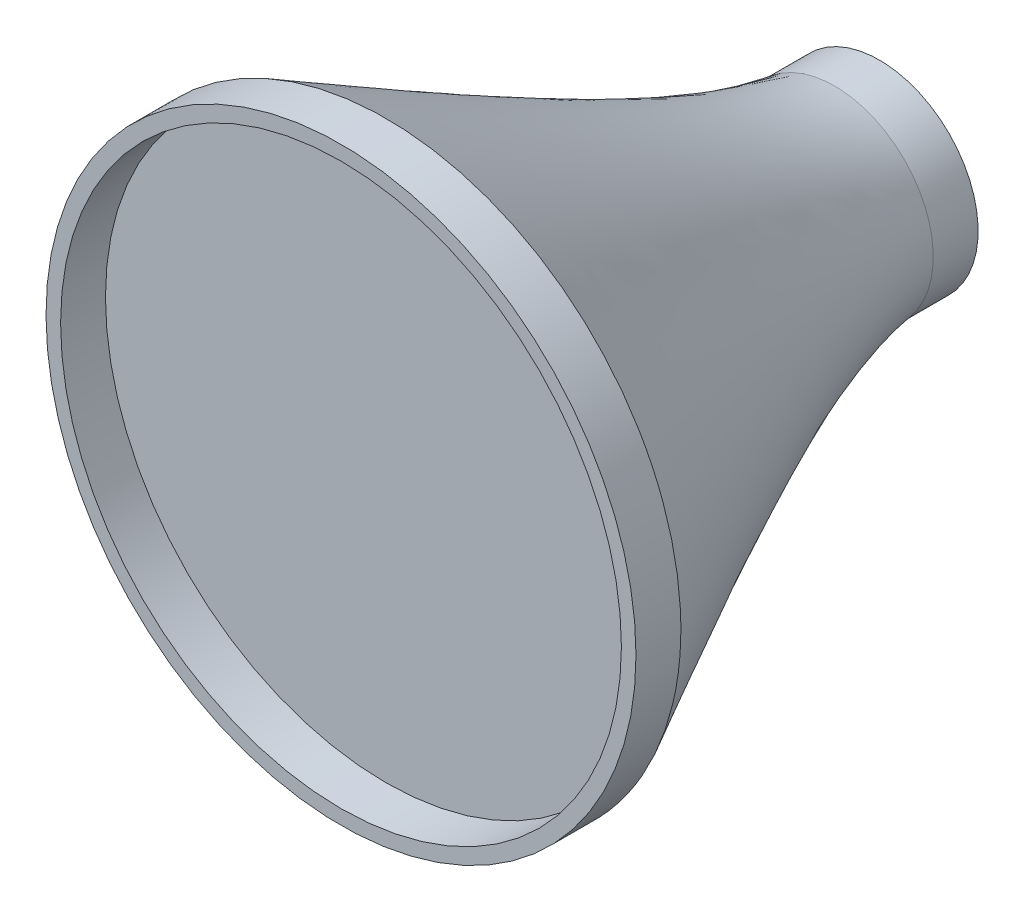
ISO-10303-21;
HEADER;
FILE_DESCRIPTION(('STEP AP214'),'2;1');
FILE_NAME('part.step','',(''),(''),'','','');
FILE_SCHEMA(('AUTOMOTIVE_DESIGN { 1 0 10303 214 1 1 1 1 }'));
ENDSEC;
DATA;
#1=APPLICATION_CONTEXT('core data for automotive mechanical design processes');
#2=APPLICATION_PROTOCOL_DEFINITION('international standard','automotive_design',2000,#1);
#3=PRODUCT_CONTEXT('',#1,'mechanical');
#4=PRODUCT('Part','Part','',(#3));
#5=PRODUCT_RELATED_PRODUCT_CATEGORY('part','',(#4));
#6=PRODUCT_DEFINITION_FORMATION('','',#4);
#7=PRODUCT_DEFINITION_CONTEXT('part definition',#1,'design');
#8=PRODUCT_DEFINITION('design','',#6,#7);
#9=PRODUCT_DEFINITION_SHAPE('','',#8);
#10=(LENGTH_UNIT() NAMED_UNIT(*) SI_UNIT(.MILLI.,.METRE.));
#11=(NAMED_UNIT(*) PLANE_ANGLE_UNIT() SI_UNIT($,.RADIAN.));
#12=(NAMED_UNIT(*) SI_UNIT($,.STERADIAN.) SOLID_ANGLE_UNIT());
#13=UNCERTAINTY_MEASURE_WITH_UNIT(LENGTH_MEASURE(1.E-05),#10,'distance_accuracy_value','');
#14=(GEOMETRIC_REPRESENTATION_CONTEXT(3) GLOBAL_UNCERTAINTY_ASSIGNED_CONTEXT((#13)) GLOBAL_UNIT_ASSIGNED_CONTEXT((#10,
#11,#12)) REPRESENTATION_CONTEXT('',''));
#15=CARTESIAN_POINT('',(0.,0.,0.));
#16=DIRECTION('',(0.,0.,1.));
#17=DIRECTION('',(1.,0.,0.));
#18=AXIS2_PLACEMENT_3D('',#15,#16,#17);
#19=CARTESIAN_POINT('',(-15.5315919542046,6.13810651732982,0.));
#20=CARTESIAN_POINT('',(-1.09532960482121,5.47959825687999,-25.4));
#21=CARTESIAN_POINT('',(-3.25537891954497,37.201290425739,0.));
#22=CARTESIAN_POINT('',(9.86386690893876,7.67025746652241,-25.4));
#23=CARTESIAN_POINT('',(27.8078049888643,24.9250773910794,0.));
#24=CARTESIAN_POINT('',(12.0545261185812,-3.28893904723757,-25.4));
#25=CARTESIAN_POINT('',(15.5315919542046,-6.13810651732982,0.));
#26=CARTESIAN_POINT('',(1.09532960482121,-5.47959825687999,-25.4));
#27=CARTESIAN_POINT('',(3.25537891954497,-37.201290425739,0.));
#28=CARTESIAN_POINT('',(-9.86386690893878,-7.67025746652241,-25.4));
#29=CARTESIAN_POINT('',(-27.8078049888642,-24.9250773910794,0.));
#30=CARTESIAN_POINT('',(-12.0545261185812,3.28893904723757,-25.4));
#31=CARTESIAN_POINT('',(-15.5315919542046,6.13810651732982,0.));
#32=CARTESIAN_POINT('',(-1.09532960482121,5.47959825687999,-25.4));
#33=(BOUNDED_SURFACE() B_SPLINE_SURFACE(3,1,((#19,#20),(#21,#22),(#23,#24),(#25,#26),(#27,#28),
(#29,#30),(#31,#32)),.UNSPECIFIED.,.T.,.F.,.F.) B_SPLINE_SURFACE_WITH_KNOTS((4,3,4),(2,2),(0.,
0.5,1.),(0.,1.),.UNSPECIFIED.) GEOMETRIC_REPRESENTATION_ITEM() RATIONAL_B_SPLINE_SURFACE(((1.,
1.),(0.333333333333333,0.333333333333333),(0.333333333333333,0.333333333333333),(1.,1.),
(0.333333333333334,0.333333333333333),(0.333333333333334,0.333333333333333),(1.,1.))) REPRESENTATION_ITEM('') SURFACE());
#34=CARTESIAN_POINT('',(0.,0.,0.));
#35=DIRECTION('',(0.,0.,1.));
#36=DIRECTION('',(1.,0.,0.));
#37=AXIS2_PLACEMENT_3D('',#34,#35,#36);
#38=CIRCLE('',#37,16.7005);
#39=CARTESIAN_POINT('',(-15.5315919542046,6.13810651732982,0.));
#40=VERTEX_POINT('',#39);
#41=EDGE_CURVE('E43',#40,#40,#38,.T.);
#42=CARTESIAN_POINT('',(0.,0.,-25.4));
#43=DIRECTION('',(0.,0.,-1.));
#44=DIRECTION('',(-1.,0.,0.));
#45=AXIS2_PLACEMENT_3D('',#42,#43,#44);
#46=CIRCLE('',#45,5.588);
#47=CARTESIAN_POINT('',(-1.09532960482121,5.47959825687999,-25.4));
#48=VERTEX_POINT('',#47);
#49=EDGE_CURVE('E105',#48,#48,#46,.T.);
#50=CARTESIAN_POINT('',(-15.5315919542046,6.13810651732982,0.));
#51=CARTESIAN_POINT('',(-15.3812142213985,6.13124705628347,-0.264583333333334));
#52=CARTESIAN_POINT('',(-15.2308364885925,6.12438759523712,-0.529166666666667));
#53=CARTESIAN_POINT('',(-14.9300810229803,6.11066867314441,-1.05833333333333));
#54=CARTESIAN_POINT('',(-14.7797032901742,6.10380921209806,-1.32291666666667));
#55=CARTESIAN_POINT('',(-14.4789478245621,6.09009029000535,-1.85208333333333));
#56=CARTESIAN_POINT('',(-14.328570091756,6.083230828959,-2.11666666666667));
#57=CARTESIAN_POINT('',(-14.0278146261438,6.0695119068663,-2.64583333333333));
#58=CARTESIAN_POINT('',(-13.8774368933378,6.06265244581994,-2.91041666666667));
#59=CARTESIAN_POINT('',(-13.5766814277256,6.04893352372724,-3.43958333333333));
#60=CARTESIAN_POINT('',(-13.4263036949195,6.04207406268089,-3.70416666666667));
#61=CARTESIAN_POINT('',(-13.1255482293074,6.02835514058818,-4.23333333333333));
#62=CARTESIAN_POINT('',(-12.9751704965013,6.02149567954183,-4.49791666666667));
#63=CARTESIAN_POINT('',(-12.6744150308891,6.00777675744912,-5.02708333333333));
#64=CARTESIAN_POINT('',(-12.5240372980831,6.00091729640277,-5.29166666666667));
#65=CARTESIAN_POINT('',(-12.2232818324709,5.98719837431007,-5.82083333333333));
#66=CARTESIAN_POINT('',(-12.0729040996648,5.98033891326372,-6.08541666666667));
#67=CARTESIAN_POINT('',(-11.7721486340527,5.96661999117101,-6.61458333333333));
#68=CARTESIAN_POINT('',(-11.6217709012466,5.95976053012466,-6.87916666666667));
#69=CARTESIAN_POINT('',(-11.3210154356345,5.94604160803195,-7.40833333333333));
#70=CARTESIAN_POINT('',(-11.1706377028284,5.9391821469856,-7.67291666666667));
#71=CARTESIAN_POINT('',(-10.8698822372162,5.9254632248929,-8.20208333333333));
#72=CARTESIAN_POINT('',(-10.7195045044101,5.91860376384654,-8.46666666666667));
#73=CARTESIAN_POINT('',(-10.418749038798,5.90488484175384,-8.99583333333333));
#74=CARTESIAN_POINT('',(-10.2683713059919,5.89802538070749,-9.26041666666666));
#75=CARTESIAN_POINT('',(-9.96761584037976,5.88430645861478,-9.78958333333333));
#76=CARTESIAN_POINT('',(-9.81723810757368,5.87744699756843,-10.0541666666667));
#77=CARTESIAN_POINT('',(-9.51648264196153,5.86372807547572,-10.5833333333333));
#78=CARTESIAN_POINT('',(-9.36610490915545,5.85686861442937,-10.8479166666667));
#79=CARTESIAN_POINT('',(-9.0653494435433,5.84314969233667,-11.3770833333333));
#80=CARTESIAN_POINT('',(-8.91497171073722,5.83629023129031,-11.6416666666667));
#81=CARTESIAN_POINT('',(-8.61421624512507,5.82257130919761,-12.1708333333333));
#82=CARTESIAN_POINT('',(-8.46383851231899,5.81571184815126,-12.4354166666667));
#83=CARTESIAN_POINT('',(-8.16308304670683,5.80199292605855,-12.9645833333333));
#84=CARTESIAN_POINT('',(-8.01270531390075,5.7951334650122,-13.2291666666667));
#85=CARTESIAN_POINT('',(-7.7119498482886,5.78141454291949,-13.7583333333333));
#86=CARTESIAN_POINT('',(-7.56157211548252,5.77455508187314,-14.0229166666667));
#87=CARTESIAN_POINT('',(-7.26081664987037,5.76083615978044,-14.5520833333333));
#88=CARTESIAN_POINT('',(-7.11043891706429,5.75397669873409,-14.8166666666667));
#89=CARTESIAN_POINT('',(-6.80968345145214,5.74025777664138,-15.3458333333333));
#90=CARTESIAN_POINT('',(-6.65930571864606,5.73339831559503,-15.6104166666667));
#91=CARTESIAN_POINT('',(-6.35855025303391,5.71967939350232,-16.1395833333333));
#92=CARTESIAN_POINT('',(-6.20817252022783,5.71281993245597,-16.4041666666667));
#93=CARTESIAN_POINT('',(-5.90741705461568,5.69910101036327,-16.9333333333333));
#94=CARTESIAN_POINT('',(-5.7570393218096,5.69224154931691,-17.1979166666667));
#95=CARTESIAN_POINT('',(-5.45628385619745,5.67852262722421,-17.7270833333333));
#96=CARTESIAN_POINT('',(-5.30590612339137,5.67166316617786,-17.9916666666667));
#97=CARTESIAN_POINT('',(-5.00515065777921,5.65794424408515,-18.5208333333333));
#98=CARTESIAN_POINT('',(-4.85477292497314,5.6510847830388,-18.7854166666667));
#99=CARTESIAN_POINT('',(-4.55401745936098,5.63736586094609,-19.3145833333333));
#100=CARTESIAN_POINT('',(-4.40363972655491,5.63050639989974,-19.5791666666667));
#101=CARTESIAN_POINT('',(-4.10288426094275,5.61678747780704,-20.1083333333333));
#102=CARTESIAN_POINT('',(-3.95250652813667,5.60992801676069,-20.3729166666667));
#103=CARTESIAN_POINT('',(-3.65175106252452,5.59620909466798,-20.9020833333333));
#104=CARTESIAN_POINT('',(-3.50137332971844,5.58934963362163,-21.1666666666667));
#105=CARTESIAN_POINT('',(-3.20061786410629,5.57563071152892,-21.6958333333333));
#106=CARTESIAN_POINT('',(-3.05024013130021,5.56877125048257,-21.9604166666667));
#107=CARTESIAN_POINT('',(-2.74948466568806,5.55505232838986,-22.4895833333333));
#108=CARTESIAN_POINT('',(-2.59910693288198,5.54819286734351,-22.7541666666667));
#109=CARTESIAN_POINT('',(-2.29835146726983,5.53447394525081,-23.2833333333333));
#110=CARTESIAN_POINT('',(-2.14797373446375,5.52761448420446,-23.5479166666667));
#111=CARTESIAN_POINT('',(-1.8472182688516,5.51389556211175,-24.0770833333333));
#112=CARTESIAN_POINT('',(-1.69684053604552,5.5070361010654,-24.3416666666667));
#113=CARTESIAN_POINT('',(-1.39608507043336,5.49331717897269,-24.8708333333333));
#114=CARTESIAN_POINT('',(-1.24570733762729,5.48645771792634,-25.1354166666667));
#115=CARTESIAN_POINT('',(-1.09532960482121,5.47959825687999,-25.4));
#116=B_SPLINE_CURVE_WITH_KNOTS('',3,(#50,#51,#52,#53,#54,#55,#56,#57,#58,#59,#60,#61,#62,#63,
#64,#65,#66,#67,#68,#69,#70,#71,#72,#73,#74,#75,#76,#77,#78,#79,#80,#81,#82,#83,#84,#85,#86,#87,
#88,#89,#90,#91,#92,#93,#94,#95,#96,#97,#98,#99,#100,#101,#102,#103,#104,#105,#106,#107,#108,
#109,#110,#111,#112,#113,#114,#115),.UNSPECIFIED.,.F.,.F.,(4,2,2,2,2,2,2,2,2,2,2,2,2,2,2,2,2,2,
2,2,2,2,2,2,2,2,2,2,2,2,2,2,4),(0.,0.913227077493698,1.8264541549874,2.73968123248109,
3.65290830997479,4.56613538746849,5.47936246496219,6.39258954245589,7.30581661994958,
8.21904369744328,9.13227077493698,10.0454978524307,10.9587249299244,11.8719520074181,
12.7851790849118,13.6984061624055,14.6116332398992,15.5248603173929,16.4380873948866,
17.3513144723803,18.264541549874,19.1777686273677,20.0909957048614,21.0042227823551,
21.9174498598488,22.8306769373425,23.7439040148362,24.6571310923299,25.5703581698236,
26.4835852473173,27.396812324811,28.3100394023046,29.2232664797983),.UNSPECIFIED.);
#117=EDGE_CURVE('BSEAM35',#40,#48,#116,.T.);
#118=ORIENTED_EDGE('',*,*,#41,.F.);
#119=ORIENTED_EDGE('',*,*,#49,.F.);
#120=ORIENTED_EDGE('',*,*,#117,.T.);
#121=ORIENTED_EDGE('',*,*,#117,.F.);
#122=EDGE_LOOP('',(#118,#120,#119,#121));
#123=FACE_BOUND('',#122,.T.);
#124=ADVANCED_FACE('F35',(#123),#33,.T.);
#125=CARTESIAN_POINT('',(0.,0.,2.54));
#126=DIRECTION('',(0.,0.,1.));
#127=DIRECTION('',(1.,0.,0.));
#128=AXIS2_PLACEMENT_3D('',#125,#126,#127);
#129=PLANE('',#128);
#130=CARTESIAN_POINT('',(0.,0.,2.54));
#131=DIRECTION('',(0.,0.,1.));
#132=DIRECTION('',(1.,0.,0.));
#133=AXIS2_PLACEMENT_3D('',#130,#131,#132);
#134=CIRCLE('',#133,16.7005);
#135=CARTESIAN_POINT('',(16.7005,0.,2.54));
#136=VERTEX_POINT('',#135);
#137=EDGE_CURVE('E48',#136,#136,#134,.T.);
#138=ORIENTED_EDGE('',*,*,#137,.T.);
#139=EDGE_LOOP('',(#138));
#140=FACE_BOUND('',#139,.T.);
#141=CARTESIAN_POINT('',(0.,0.,2.54));
#142=DIRECTION('',(0.,0.,1.));
#143=DIRECTION('',(1.,0.,0.));
#144=AXIS2_PLACEMENT_3D('',#141,#142,#143);
#145=CIRCLE('',#144,15.875);
#146=CARTESIAN_POINT('',(15.875,0.,2.54));
#147=VERTEX_POINT('',#146);
#148=EDGE_CURVE('E110',#147,#147,#145,.T.);
#149=ORIENTED_EDGE('',*,*,#148,.F.);
#150=EDGE_LOOP('',(#149));
#151=FACE_BOUND('',#150,.T.);
#152=ADVANCED_FACE('F72',(#140,#151),#129,.T.);
#153=CARTESIAN_POINT('',(0.,0.,2.54));
#154=DIRECTION('',(0.,0.,-1.));
#155=DIRECTION('',(-1.,0.,0.));
#156=AXIS2_PLACEMENT_3D('',#153,#154,#155);
#157=CYLINDRICAL_SURFACE('',#156,16.7005);
#158=ORIENTED_EDGE('',*,*,#137,.F.);
#159=EDGE_LOOP('',(#158));
#160=FACE_BOUND('',#159,.T.);
#161=ORIENTED_EDGE('',*,*,#41,.T.);
#162=EDGE_LOOP('',(#161));
#163=FACE_BOUND('',#162,.T.);
#164=ADVANCED_FACE('F61',(#160,#163),#157,.T.);
#165=CARTESIAN_POINT('',(0.,0.,2.54));
#166=DIRECTION('',(0.,0.,-1.));
#167=DIRECTION('',(-1.,0.,0.));
#168=AXIS2_PLACEMENT_3D('',#165,#166,#167);
#169=CYLINDRICAL_SURFACE('',#168,15.875);
#170=ORIENTED_EDGE('',*,*,#148,.T.);
#171=EDGE_LOOP('',(#170));
#172=FACE_BOUND('',#171,.T.);
#173=CARTESIAN_POINT('',(0.,0.,0.));
#174=DIRECTION('',(0.,0.,1.));
#175=DIRECTION('',(1.,0.,0.));
#176=AXIS2_PLACEMENT_3D('',#173,#174,#175);
#177=CIRCLE('',#176,15.875);
#178=CARTESIAN_POINT('',(15.875,0.,0.));
#179=VERTEX_POINT('',#178);
#180=EDGE_CURVE('E11',#179,#179,#177,.F.);
#181=ORIENTED_EDGE('',*,*,#180,.T.);
#182=EDGE_LOOP('',(#181));
#183=FACE_BOUND('',#182,.T.);
#184=ADVANCED_FACE('F71',(#172,#183),#169,.F.);
#185=CARTESIAN_POINT('',(0.,0.,0.));
#186=DIRECTION('',(0.,0.,1.));
#187=DIRECTION('',(1.,0.,0.));
#188=AXIS2_PLACEMENT_3D('',#185,#186,#187);
#189=PLANE('',#188);
#190=ORIENTED_EDGE('',*,*,#180,.F.);
#191=EDGE_LOOP('',(#190));
#192=FACE_BOUND('',#191,.T.);
#193=ADVANCED_FACE('F75',(#192),#189,.T.);
#194=CARTESIAN_POINT('',(0.,0.,-27.94));
#195=DIRECTION('',(0.,0.,-1.));
#196=DIRECTION('',(-1.,0.,0.));
#197=AXIS2_PLACEMENT_3D('',#194,#195,#196);
#198=PLANE('',#197);
#199=CARTESIAN_POINT('',(0.,0.,-27.94));
#200=DIRECTION('',(0.,0.,-1.));
#201=DIRECTION('',(-1.,0.,0.));
#202=AXIS2_PLACEMENT_3D('',#199,#200,#201);
#203=CIRCLE('',#202,5.588);
#204=CARTESIAN_POINT('',(-5.588,0.,-27.94));
#205=VERTEX_POINT('',#204);
#206=EDGE_CURVE('E107',#205,#205,#203,.T.);
#207=ORIENTED_EDGE('',*,*,#206,.T.);
#208=EDGE_LOOP('',(#207));
#209=FACE_BOUND('',#208,.T.);
#210=CARTESIAN_POINT('',(0.,0.,-27.94));
#211=DIRECTION('',(0.,0.,-1.));
#212=DIRECTION('',(-1.,0.,0.));
#213=AXIS2_PLACEMENT_3D('',#210,#211,#212);
#214=CIRCLE('',#213,5.08);
#215=CARTESIAN_POINT('',(-5.08,0.,-27.94));
#216=VERTEX_POINT('',#215);
#217=EDGE_CURVE('E108',#216,#216,#214,.T.);
#218=ORIENTED_EDGE('',*,*,#217,.F.);
#219=EDGE_LOOP('',(#218));
#220=FACE_BOUND('',#219,.T.);
#221=ADVANCED_FACE('F77',(#209,#220),#198,.T.);
#222=CARTESIAN_POINT('',(0.,0.,-27.94));
#223=DIRECTION('',(0.,0.,1.));
#224=DIRECTION('',(1.,0.,0.));
#225=AXIS2_PLACEMENT_3D('',#222,#223,#224);
#226=CYLINDRICAL_SURFACE('',#225,5.588);
#227=ORIENTED_EDGE('',*,*,#206,.F.);
#228=EDGE_LOOP('',(#227));
#229=FACE_BOUND('',#228,.T.);
#230=ORIENTED_EDGE('',*,*,#49,.T.);
#231=EDGE_LOOP('',(#230));
#232=FACE_BOUND('',#231,.T.);
#233=ADVANCED_FACE('F119',(#229,#232),#226,.T.);
#234=CARTESIAN_POINT('',(0.,0.,-27.94));
#235=DIRECTION('',(0.,0.,1.));
#236=DIRECTION('',(1.,0.,0.));
#237=AXIS2_PLACEMENT_3D('',#234,#235,#236);
#238=CYLINDRICAL_SURFACE('',#237,5.08);
#239=ORIENTED_EDGE('',*,*,#217,.T.);
#240=EDGE_LOOP('',(#239));
#241=FACE_BOUND('',#240,.T.);
#242=CARTESIAN_POINT('',(0.,0.,-25.4));
#243=DIRECTION('',(0.,0.,-1.));
#244=DIRECTION('',(-1.,0.,0.));
#245=AXIS2_PLACEMENT_3D('',#242,#243,#244);
#246=CIRCLE('',#245,5.08);
#247=CARTESIAN_POINT('',(-5.08,0.,-25.4));
#248=VERTEX_POINT('',#247);
#249=EDGE_CURVE('E113',#248,#248,#246,.T.);
#250=ORIENTED_EDGE('',*,*,#249,.F.);
#251=EDGE_LOOP('',(#250));
#252=FACE_BOUND('',#251,.T.);
#253=ADVANCED_FACE('F128',(#241,#252),#238,.F.);
#254=CARTESIAN_POINT('',(0.,0.,-25.4));
#255=DIRECTION('',(0.,0.,1.));
#256=DIRECTION('',(1.,0.,0.));
#257=AXIS2_PLACEMENT_3D('',#254,#255,#256);
#258=PLANE('',#257);
#259=ORIENTED_EDGE('',*,*,#249,.T.);
#260=EDGE_LOOP('',(#259));
#261=FACE_BOUND('',#260,.T.);
#262=ADVANCED_FACE('F37',(#261),#258,.F.);
#263=CLOSED_SHELL('',(#124,#152,#164,#184,#193,#221,#233,#253,#262));
#264=MANIFOLD_SOLID_BREP('B2',#263);
#265=ADVANCED_BREP_SHAPE_REPRESENTATION('',(#18,#264),#14);
#266=SHAPE_DEFINITION_REPRESENTATION(#9,#265);
ENDSEC;
END-ISO-10303-21;
